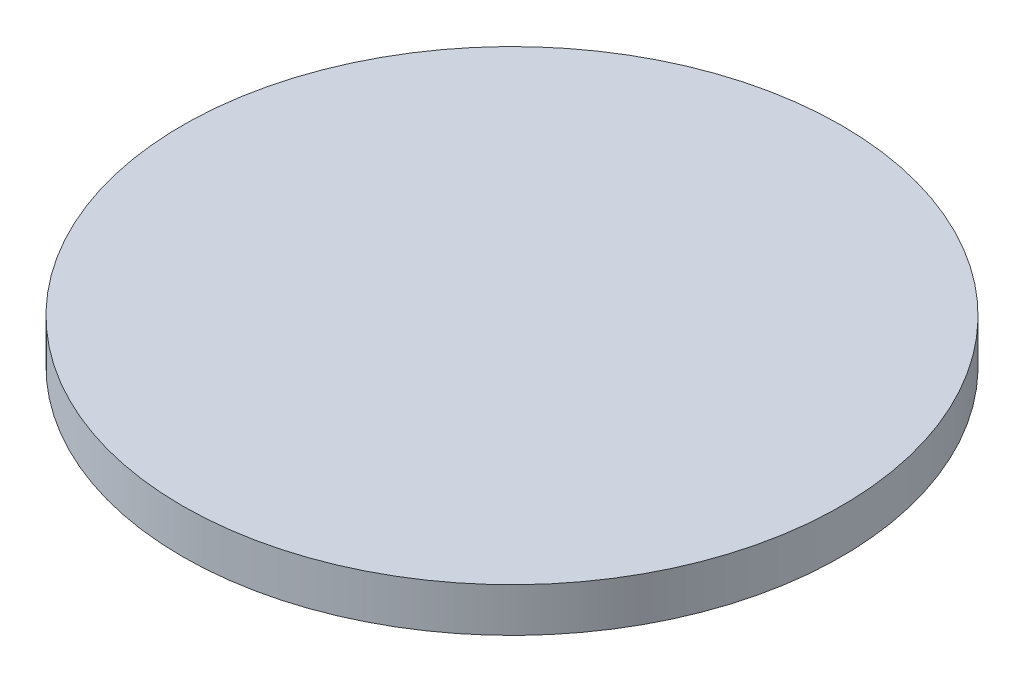
ISO-10303-21;
HEADER;
FILE_DESCRIPTION(('STEP AP214'),'2;1');
FILE_NAME('part.step','',(''),(''),'','','');
FILE_SCHEMA(('AUTOMOTIVE_DESIGN { 1 0 10303 214 1 1 1 1 }'));
ENDSEC;
DATA;
#1=APPLICATION_CONTEXT('core data for automotive mechanical design processes');
#2=APPLICATION_PROTOCOL_DEFINITION('international standard','automotive_design',2000,#1);
#3=PRODUCT_CONTEXT('',#1,'mechanical');
#4=PRODUCT('Part','Part','',(#3));
#5=PRODUCT_RELATED_PRODUCT_CATEGORY('part','',(#4));
#6=PRODUCT_DEFINITION_FORMATION('','',#4);
#7=PRODUCT_DEFINITION_CONTEXT('part definition',#1,'design');
#8=PRODUCT_DEFINITION('design','',#6,#7);
#9=PRODUCT_DEFINITION_SHAPE('','',#8);
#10=(LENGTH_UNIT() NAMED_UNIT(*) SI_UNIT(.MILLI.,.METRE.));
#11=(NAMED_UNIT(*) PLANE_ANGLE_UNIT() SI_UNIT($,.RADIAN.));
#12=(NAMED_UNIT(*) SI_UNIT($,.STERADIAN.) SOLID_ANGLE_UNIT());
#13=UNCERTAINTY_MEASURE_WITH_UNIT(LENGTH_MEASURE(1.E-05),#10,'distance_accuracy_value','');
#14=(GEOMETRIC_REPRESENTATION_CONTEXT(3) GLOBAL_UNCERTAINTY_ASSIGNED_CONTEXT((#13)) GLOBAL_UNIT_ASSIGNED_CONTEXT((#10,
#11,#12)) REPRESENTATION_CONTEXT('',''));
#15=CARTESIAN_POINT('',(0.,0.,0.));
#16=DIRECTION('',(0.,0.,1.));
#17=DIRECTION('',(1.,0.,0.));
#18=AXIS2_PLACEMENT_3D('',#15,#16,#17);
#19=CARTESIAN_POINT('',(0.,30.,0.));
#20=DIRECTION('',(0.,-1.,0.));
#21=DIRECTION('',(0.,0.,-1.));
#22=AXIS2_PLACEMENT_3D('',#19,#20,#21);
#23=CYLINDRICAL_SURFACE('',#22,225.);
#24=CARTESIAN_POINT('',(0.,30.,0.));
#25=DIRECTION('',(0.,1.,0.));
#26=DIRECTION('',(0.,0.,1.));
#27=AXIS2_PLACEMENT_3D('',#24,#25,#26);
#28=CIRCLE('',#27,225.);
#29=CARTESIAN_POINT('',(0.,30.,225.));
#30=VERTEX_POINT('',#29);
#31=EDGE_CURVE('E10',#30,#30,#28,.T.);
#32=ORIENTED_EDGE('',*,*,#31,.F.);
#33=EDGE_LOOP('',(#32));
#34=FACE_BOUND('',#33,.T.);
#35=CARTESIAN_POINT('',(0.,0.,0.));
#36=DIRECTION('',(0.,1.,0.));
#37=DIRECTION('',(0.,0.,1.));
#38=AXIS2_PLACEMENT_3D('',#35,#36,#37);
#39=CIRCLE('',#38,225.);
#40=CARTESIAN_POINT('',(0.,0.,225.));
#41=VERTEX_POINT('',#40);
#42=EDGE_CURVE('E40',#41,#41,#39,.T.);
#43=ORIENTED_EDGE('',*,*,#42,.T.);
#44=EDGE_LOOP('',(#43));
#45=FACE_BOUND('',#44,.T.);
#46=ADVANCED_FACE('F37',(#34,#45),#23,.T.);
#47=CARTESIAN_POINT('',(0.,30.,0.));
#48=DIRECTION('',(0.,1.,0.));
#49=DIRECTION('',(0.,0.,1.));
#50=AXIS2_PLACEMENT_3D('',#47,#48,#49);
#51=PLANE('',#50);
#52=ORIENTED_EDGE('',*,*,#31,.T.);
#53=EDGE_LOOP('',(#52));
#54=FACE_BOUND('',#53,.T.);
#55=ADVANCED_FACE('F70',(#54),#51,.T.);
#56=CARTESIAN_POINT('',(0.,0.,0.));
#57=DIRECTION('',(0.,1.,0.));
#58=DIRECTION('',(0.,0.,1.));
#59=AXIS2_PLACEMENT_3D('',#56,#57,#58);
#60=PLANE('',#59);
#61=CARTESIAN_POINT('',(0.,0.,0.));
#62=DIRECTION('',(0.,-1.,0.));
#63=DIRECTION('',(0.,0.,-1.));
#64=AXIS2_PLACEMENT_3D('',#61,#62,#63);
#65=CIRCLE('',#64,208.09128286366);
#66=CARTESIAN_POINT('',(0.,0.,-208.09128286366));
#67=VERTEX_POINT('',#66);
#68=EDGE_CURVE('E51',#67,#67,#65,.T.);
#69=ORIENTED_EDGE('',*,*,#68,.F.);
#70=EDGE_LOOP('',(#69));
#71=FACE_BOUND('',#70,.T.);
#72=ORIENTED_EDGE('',*,*,#42,.F.);
#73=EDGE_LOOP('',(#72));
#74=FACE_BOUND('',#73,.T.);
#75=ADVANCED_FACE('F64',(#71,#74),#60,.F.);
#76=CARTESIAN_POINT('',(0.,20.,0.));
#77=DIRECTION('',(0.,-1.,0.));
#78=DIRECTION('',(0.,0.,-1.));
#79=AXIS2_PLACEMENT_3D('',#76,#77,#78);
#80=CYLINDRICAL_SURFACE('',#79,208.09128286366);
#81=CARTESIAN_POINT('',(0.,20.,0.));
#82=DIRECTION('',(0.,-1.,0.));
#83=DIRECTION('',(0.,0.,-1.));
#84=AXIS2_PLACEMENT_3D('',#81,#82,#83);
#85=CIRCLE('',#84,208.09128286366);
#86=CARTESIAN_POINT('',(0.,20.,-208.09128286366));
#87=VERTEX_POINT('',#86);
#88=EDGE_CURVE('E49',#87,#87,#85,.T.);
#89=ORIENTED_EDGE('',*,*,#88,.F.);
#90=EDGE_LOOP('',(#89));
#91=FACE_BOUND('',#90,.T.);
#92=ORIENTED_EDGE('',*,*,#68,.T.);
#93=EDGE_LOOP('',(#92));
#94=FACE_BOUND('',#93,.T.);
#95=ADVANCED_FACE('F61',(#91,#94),#80,.F.);
#96=CARTESIAN_POINT('',(0.,20.,0.));
#97=DIRECTION('',(0.,-1.,0.));
#98=DIRECTION('',(0.,0.,-1.));
#99=AXIS2_PLACEMENT_3D('',#96,#97,#98);
#100=PLANE('',#99);
#101=ORIENTED_EDGE('',*,*,#88,.T.);
#102=EDGE_LOOP('',(#101));
#103=FACE_BOUND('',#102,.T.);
#104=ADVANCED_FACE('F59',(#103),#100,.T.);
#105=CLOSED_SHELL('',(#46,#55,#75,#95,#104));
#106=MANIFOLD_SOLID_BREP('B2',#105);
#107=ADVANCED_BREP_SHAPE_REPRESENTATION('',(#18,#106),#14);
#108=SHAPE_DEFINITION_REPRESENTATION(#9,#107);
ENDSEC;
END-ISO-10303-21;
